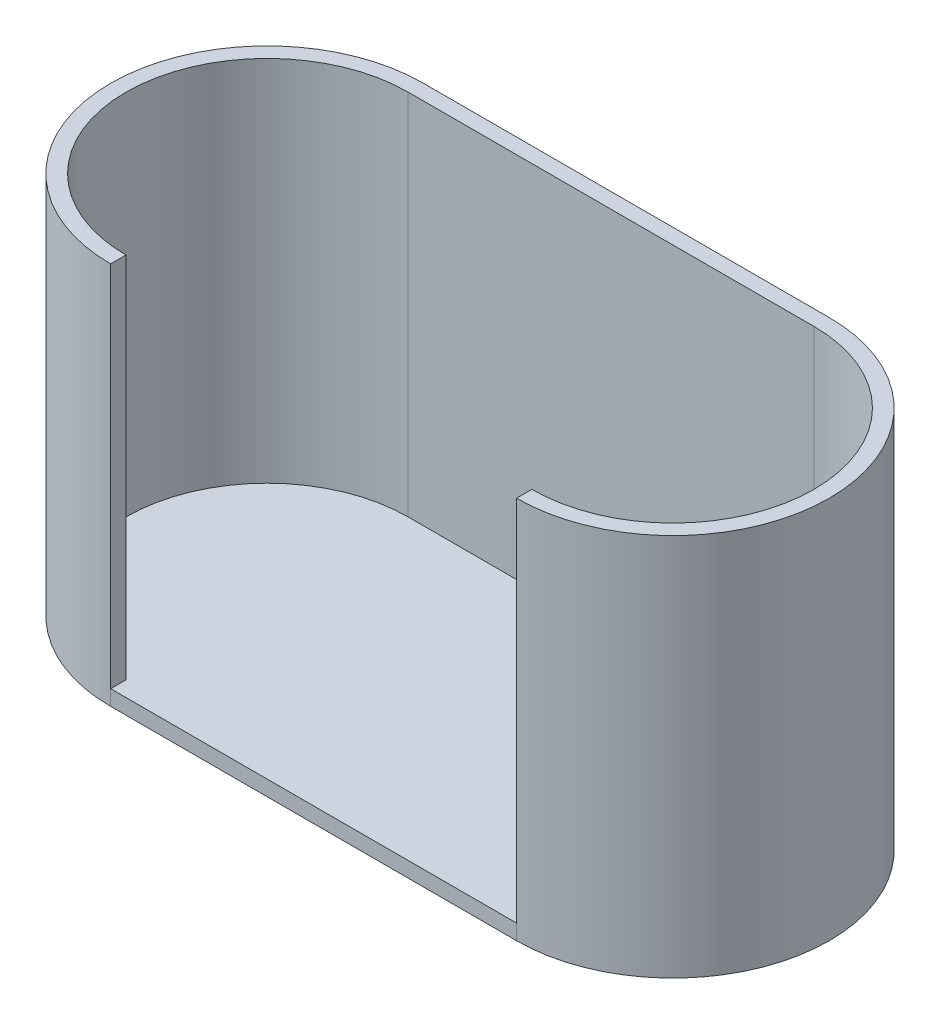
ISO-10303-21;
HEADER;
FILE_DESCRIPTION(('STEP AP214'),'2;1');
FILE_NAME('part.step','',(''),(''),'','','');
FILE_SCHEMA(('AUTOMOTIVE_DESIGN { 1 0 10303 214 1 1 1 1 }'));
ENDSEC;
DATA;
#1=APPLICATION_CONTEXT('core data for automotive mechanical design processes');
#2=APPLICATION_PROTOCOL_DEFINITION('international standard','automotive_design',2000,#1);
#3=PRODUCT_CONTEXT('',#1,'mechanical');
#4=PRODUCT('Part','Part','',(#3));
#5=PRODUCT_RELATED_PRODUCT_CATEGORY('part','',(#4));
#6=PRODUCT_DEFINITION_FORMATION('','',#4);
#7=PRODUCT_DEFINITION_CONTEXT('part definition',#1,'design');
#8=PRODUCT_DEFINITION('design','',#6,#7);
#9=PRODUCT_DEFINITION_SHAPE('','',#8);
#10=(LENGTH_UNIT() NAMED_UNIT(*) SI_UNIT(.MILLI.,.METRE.));
#11=(NAMED_UNIT(*) PLANE_ANGLE_UNIT() SI_UNIT($,.RADIAN.));
#12=(NAMED_UNIT(*) SI_UNIT($,.STERADIAN.) SOLID_ANGLE_UNIT());
#13=UNCERTAINTY_MEASURE_WITH_UNIT(LENGTH_MEASURE(1.E-05),#10,'distance_accuracy_value','');
#14=(GEOMETRIC_REPRESENTATION_CONTEXT(3) GLOBAL_UNCERTAINTY_ASSIGNED_CONTEXT((#13)) GLOBAL_UNIT_ASSIGNED_CONTEXT((#10,
#11,#12)) REPRESENTATION_CONTEXT('',''));
#15=CARTESIAN_POINT('',(0.,0.,0.));
#16=DIRECTION('',(0.,0.,1.));
#17=DIRECTION('',(1.,0.,0.));
#18=AXIS2_PLACEMENT_3D('',#15,#16,#17);
#19=CARTESIAN_POINT('',(-26.477298014183,50.,20.4070469493143));
#20=DIRECTION('',(0.,0.,-1.));
#21=DIRECTION('',(-1.,0.,0.));
#22=AXIS2_PLACEMENT_3D('',#19,#20,#21);
#23=PLANE('',#22);
#24=DIRECTION('',(1.,0.,0.));
#25=VECTOR('',#24,1.);
#26=CARTESIAN_POINT('',(-26.477298014183,2.,20.4070469493143));
#27=LINE('',#26,#25);
#28=CARTESIAN_POINT('',(-26.477298014183,2.,20.4070469493143));
#29=VERTEX_POINT('',#28);
#30=CARTESIAN_POINT('',(26.477298014183,2.,20.4070469493143));
#31=VERTEX_POINT('',#30);
#32=EDGE_CURVE('E139',#29,#31,#27,.T.);
#33=ORIENTED_EDGE('',*,*,#32,.F.);
#34=DIRECTION('',(0.,-1.,0.));
#35=VECTOR('',#34,1.);
#36=CARTESIAN_POINT('',(-26.477298014183,50.,20.4070469493143));
#37=LINE('',#36,#35);
#38=CARTESIAN_POINT('',(-26.477298014183,0.,20.4070469493143));
#39=VERTEX_POINT('',#38);
#40=EDGE_CURVE('E48',#29,#39,#37,.T.);
#41=ORIENTED_EDGE('',*,*,#40,.T.);
#42=DIRECTION('',(1.,0.,0.));
#43=VECTOR('',#42,1.);
#44=CARTESIAN_POINT('',(-26.477298014183,0.,20.4070469493143));
#45=LINE('',#44,#43);
#46=CARTESIAN_POINT('',(26.477298014183,0.,20.4070469493143));
#47=VERTEX_POINT('',#46);
#48=EDGE_CURVE('E107',#39,#47,#45,.T.);
#49=ORIENTED_EDGE('',*,*,#48,.T.);
#50=DIRECTION('',(0.,-1.,0.));
#51=VECTOR('',#50,1.);
#52=CARTESIAN_POINT('',(26.477298014183,50.,20.4070469493143));
#53=LINE('',#52,#51);
#54=EDGE_CURVE('E123',#31,#47,#53,.T.);
#55=ORIENTED_EDGE('',*,*,#54,.F.);
#56=EDGE_LOOP('',(#33,#41,#49,#55));
#57=FACE_BOUND('',#56,.T.);
#58=ADVANCED_FACE('F39',(#57),#23,.F.);
#59=CARTESIAN_POINT('',(-26.477298014183,50.,0.));
#60=DIRECTION('',(0.,-1.,0.));
#61=DIRECTION('',(0.,0.,-1.));
#62=AXIS2_PLACEMENT_3D('',#59,#60,#61);
#63=CYLINDRICAL_SURFACE('',#62,20.4070469493143);
#64=CARTESIAN_POINT('',(-26.477298014183,0.,0.));
#65=DIRECTION('',(0.,1.,0.));
#66=DIRECTION('',(0.,0.,1.));
#67=AXIS2_PLACEMENT_3D('',#64,#65,#66);
#68=CIRCLE('',#67,20.4070469493143);
#69=CARTESIAN_POINT('',(-26.477298014183,0.,-20.4070469493143));
#70=VERTEX_POINT('',#69);
#71=EDGE_CURVE('E100',#70,#39,#68,.T.);
#72=ORIENTED_EDGE('',*,*,#71,.T.);
#73=ORIENTED_EDGE('',*,*,#40,.F.);
#74=CARTESIAN_POINT('',(-26.477298014183,50.,20.4070469493143));
#75=VERTEX_POINT('',#74);
#76=EDGE_CURVE('E11',#75,#29,#37,.T.);
#77=ORIENTED_EDGE('',*,*,#76,.F.);
#78=CARTESIAN_POINT('',(-26.477298014183,50.,0.));
#79=DIRECTION('',(0.,1.,0.));
#80=DIRECTION('',(0.,0.,1.));
#81=AXIS2_PLACEMENT_3D('',#78,#79,#80);
#82=CIRCLE('',#81,20.4070469493143);
#83=CARTESIAN_POINT('',(-26.477298014183,50.,-20.4070469493143));
#84=VERTEX_POINT('',#83);
#85=EDGE_CURVE('E94',#84,#75,#82,.T.);
#86=ORIENTED_EDGE('',*,*,#85,.F.);
#87=DIRECTION('',(0.,-1.,0.));
#88=VECTOR('',#87,1.);
#89=CARTESIAN_POINT('',(-26.477298014183,50.,-20.4070469493143));
#90=LINE('',#89,#88);
#91=EDGE_CURVE('E86',#84,#70,#90,.T.);
#92=ORIENTED_EDGE('',*,*,#91,.T.);
#93=EDGE_LOOP('',(#72,#73,#77,#86,#92));
#94=FACE_BOUND('',#93,.T.);
#95=ADVANCED_FACE('F41',(#94),#63,.T.);
#96=CARTESIAN_POINT('',(26.477298014183,50.,0.));
#97=DIRECTION('',(0.,-1.,0.));
#98=DIRECTION('',(0.,0.,-1.));
#99=AXIS2_PLACEMENT_3D('',#96,#97,#98);
#100=CYLINDRICAL_SURFACE('',#99,20.4070469493143);
#101=CARTESIAN_POINT('',(26.477298014183,0.,0.));
#102=DIRECTION('',(0.,1.,0.));
#103=DIRECTION('',(0.,0.,1.));
#104=AXIS2_PLACEMENT_3D('',#101,#102,#103);
#105=CIRCLE('',#104,20.4070469493143);
#106=CARTESIAN_POINT('',(26.477298014183,0.,-20.4070469493143));
#107=VERTEX_POINT('',#106);
#108=EDGE_CURVE('E95',#47,#107,#105,.T.);
#109=ORIENTED_EDGE('',*,*,#108,.T.);
#110=DIRECTION('',(0.,-1.,0.));
#111=VECTOR('',#110,1.);
#112=CARTESIAN_POINT('',(26.477298014183,50.,-20.4070469493143));
#113=LINE('',#112,#111);
#114=CARTESIAN_POINT('',(26.477298014183,50.,-20.4070469493143));
#115=VERTEX_POINT('',#114);
#116=EDGE_CURVE('E89',#115,#107,#113,.T.);
#117=ORIENTED_EDGE('',*,*,#116,.F.);
#118=CARTESIAN_POINT('',(26.477298014183,50.,0.));
#119=DIRECTION('',(0.,1.,0.));
#120=DIRECTION('',(0.,0.,1.));
#121=AXIS2_PLACEMENT_3D('',#118,#119,#120);
#122=CIRCLE('',#121,20.4070469493143);
#123=CARTESIAN_POINT('',(26.477298014183,50.,20.4070469493143));
#124=VERTEX_POINT('',#123);
#125=EDGE_CURVE('E187',#124,#115,#122,.T.);
#126=ORIENTED_EDGE('',*,*,#125,.F.);
#127=EDGE_CURVE('E124',#124,#31,#53,.T.);
#128=ORIENTED_EDGE('',*,*,#127,.T.);
#129=ORIENTED_EDGE('',*,*,#54,.T.);
#130=EDGE_LOOP('',(#109,#117,#126,#128,#129));
#131=FACE_BOUND('',#130,.T.);
#132=ADVANCED_FACE('F134',(#131),#100,.T.);
#133=CARTESIAN_POINT('',(-26.477298014183,50.,-20.4070469493143));
#134=DIRECTION('',(0.,0.,1.));
#135=DIRECTION('',(1.,0.,0.));
#136=AXIS2_PLACEMENT_3D('',#133,#134,#135);
#137=PLANE('',#136);
#138=DIRECTION('',(-1.,0.,0.));
#139=VECTOR('',#138,1.);
#140=CARTESIAN_POINT('',(-26.477298014183,0.,-20.4070469493143));
#141=LINE('',#140,#139);
#142=EDGE_CURVE('E83',#107,#70,#141,.T.);
#143=ORIENTED_EDGE('',*,*,#142,.T.);
#144=ORIENTED_EDGE('',*,*,#91,.F.);
#145=DIRECTION('',(-1.,0.,0.));
#146=VECTOR('',#145,1.);
#147=CARTESIAN_POINT('',(-26.477298014183,50.,-20.4070469493143));
#148=LINE('',#147,#146);
#149=EDGE_CURVE('E64',#115,#84,#148,.T.);
#150=ORIENTED_EDGE('',*,*,#149,.F.);
#151=ORIENTED_EDGE('',*,*,#116,.T.);
#152=EDGE_LOOP('',(#143,#144,#150,#151));
#153=FACE_BOUND('',#152,.T.);
#154=ADVANCED_FACE('F85',(#153),#137,.F.);
#155=CARTESIAN_POINT('',(-26.477298014183,50.,0.));
#156=DIRECTION('',(0.,1.,0.));
#157=DIRECTION('',(0.,0.,1.));
#158=AXIS2_PLACEMENT_3D('',#155,#156,#157);
#159=PLANE('',#158);
#160=DIRECTION('',(0.,0.,1.));
#161=VECTOR('',#160,1.);
#162=CARTESIAN_POINT('',(-26.477298014183,50.,20.4070469493143));
#163=LINE('',#162,#161);
#164=CARTESIAN_POINT('',(-26.477298014183,50.,18.4070469493143));
#165=VERTEX_POINT('',#164);
#166=EDGE_CURVE('E109',#165,#75,#163,.T.);
#167=ORIENTED_EDGE('',*,*,#166,.F.);
#168=CARTESIAN_POINT('',(-26.477298014183,50.,0.));
#169=DIRECTION('',(0.,1.,0.));
#170=DIRECTION('',(0.,0.,1.));
#171=AXIS2_PLACEMENT_3D('',#168,#169,#170);
#172=CIRCLE('',#171,18.4070469493143);
#173=CARTESIAN_POINT('',(-26.477298014183,50.,-18.4070469493143));
#174=VERTEX_POINT('',#173);
#175=EDGE_CURVE('E166',#174,#165,#172,.T.);
#176=ORIENTED_EDGE('',*,*,#175,.F.);
#177=DIRECTION('',(-1.,0.,0.));
#178=VECTOR('',#177,1.);
#179=CARTESIAN_POINT('',(-26.477298014183,50.,-18.4070469493143));
#180=LINE('',#179,#178);
#181=CARTESIAN_POINT('',(26.477298014183,50.,-18.4070469493143));
#182=VERTEX_POINT('',#181);
#183=EDGE_CURVE('E202',#182,#174,#180,.T.);
#184=ORIENTED_EDGE('',*,*,#183,.F.);
#185=CARTESIAN_POINT('',(26.477298014183,50.,0.));
#186=DIRECTION('',(0.,1.,0.));
#187=DIRECTION('',(0.,0.,1.));
#188=AXIS2_PLACEMENT_3D('',#185,#186,#187);
#189=CIRCLE('',#188,18.4070469493143);
#190=CARTESIAN_POINT('',(26.477298014183,50.,18.4070469493143));
#191=VERTEX_POINT('',#190);
#192=EDGE_CURVE('E189',#191,#182,#189,.T.);
#193=ORIENTED_EDGE('',*,*,#192,.F.);
#194=DIRECTION('',(0.,0.,1.));
#195=VECTOR('',#194,1.);
#196=CARTESIAN_POINT('',(26.477298014183,50.,20.4070469493143));
#197=LINE('',#196,#195);
#198=EDGE_CURVE('E181',#191,#124,#197,.T.);
#199=ORIENTED_EDGE('',*,*,#198,.T.);
#200=ORIENTED_EDGE('',*,*,#125,.T.);
#201=ORIENTED_EDGE('',*,*,#149,.T.);
#202=ORIENTED_EDGE('',*,*,#85,.T.);
#203=EDGE_LOOP('',(#167,#176,#184,#193,#199,#200,#201,#202));
#204=FACE_BOUND('',#203,.T.);
#205=ADVANCED_FACE('F186',(#204),#159,.T.);
#206=CARTESIAN_POINT('',(-26.477298014183,0.,0.));
#207=DIRECTION('',(0.,1.,0.));
#208=DIRECTION('',(0.,0.,1.));
#209=AXIS2_PLACEMENT_3D('',#206,#207,#208);
#210=PLANE('',#209);
#211=ORIENTED_EDGE('',*,*,#71,.F.);
#212=ORIENTED_EDGE('',*,*,#142,.F.);
#213=ORIENTED_EDGE('',*,*,#108,.F.);
#214=ORIENTED_EDGE('',*,*,#48,.F.);
#215=EDGE_LOOP('',(#211,#212,#213,#214));
#216=FACE_BOUND('',#215,.T.);
#217=ADVANCED_FACE('F105',(#216),#210,.F.);
#218=CARTESIAN_POINT('',(-26.477298014183,50.,20.4070469493143));
#219=DIRECTION('',(1.,0.,0.));
#220=DIRECTION('',(0.,-1.,0.));
#221=AXIS2_PLACEMENT_3D('',#218,#219,#220);
#222=PLANE('',#221);
#223=ORIENTED_EDGE('',*,*,#76,.T.);
#224=DIRECTION('',(0.,0.,1.));
#225=VECTOR('',#224,1.);
#226=CARTESIAN_POINT('',(-26.477298014183,2.,20.4070469493143));
#227=LINE('',#226,#225);
#228=CARTESIAN_POINT('',(-26.477298014183,2.,18.4070469493143));
#229=VERTEX_POINT('',#228);
#230=EDGE_CURVE('E115',#229,#29,#227,.T.);
#231=ORIENTED_EDGE('',*,*,#230,.F.);
#232=DIRECTION('',(0.,-1.,0.));
#233=VECTOR('',#232,1.);
#234=CARTESIAN_POINT('',(-26.477298014183,50.,18.4070469493143));
#235=LINE('',#234,#233);
#236=EDGE_CURVE('E191',#165,#229,#235,.T.);
#237=ORIENTED_EDGE('',*,*,#236,.F.);
#238=ORIENTED_EDGE('',*,*,#166,.T.);
#239=EDGE_LOOP('',(#223,#231,#237,#238));
#240=FACE_BOUND('',#239,.T.);
#241=ADVANCED_FACE('F231',(#240),#222,.T.);
#242=CARTESIAN_POINT('',(26.477298014183,50.,20.4070469493143));
#243=DIRECTION('',(1.,0.,0.));
#244=DIRECTION('',(0.,-1.,0.));
#245=AXIS2_PLACEMENT_3D('',#242,#243,#244);
#246=PLANE('',#245);
#247=ORIENTED_EDGE('',*,*,#127,.F.);
#248=ORIENTED_EDGE('',*,*,#198,.F.);
#249=DIRECTION('',(0.,-1.,0.));
#250=VECTOR('',#249,1.);
#251=CARTESIAN_POINT('',(26.477298014183,50.,18.4070469493143));
#252=LINE('',#251,#250);
#253=CARTESIAN_POINT('',(26.477298014183,2.,18.4070469493143));
#254=VERTEX_POINT('',#253);
#255=EDGE_CURVE('E208',#191,#254,#252,.T.);
#256=ORIENTED_EDGE('',*,*,#255,.T.);
#257=DIRECTION('',(0.,0.,1.));
#258=VECTOR('',#257,1.);
#259=CARTESIAN_POINT('',(26.477298014183,2.,20.4070469493143));
#260=LINE('',#259,#258);
#261=EDGE_CURVE('E183',#254,#31,#260,.T.);
#262=ORIENTED_EDGE('',*,*,#261,.T.);
#263=EDGE_LOOP('',(#247,#248,#256,#262));
#264=FACE_BOUND('',#263,.T.);
#265=ADVANCED_FACE('F179',(#264),#246,.F.);
#266=CARTESIAN_POINT('',(-26.477298014183,50.,0.));
#267=DIRECTION('',(0.,-1.,0.));
#268=DIRECTION('',(0.,0.,-1.));
#269=AXIS2_PLACEMENT_3D('',#266,#267,#268);
#270=CYLINDRICAL_SURFACE('',#269,18.4070469493143);
#271=CARTESIAN_POINT('',(-26.477298014183,2.,0.));
#272=DIRECTION('',(0.,1.,0.));
#273=DIRECTION('',(0.,0.,1.));
#274=AXIS2_PLACEMENT_3D('',#271,#272,#273);
#275=CIRCLE('',#274,18.4070469493143);
#276=CARTESIAN_POINT('',(-26.477298014183,2.,-18.4070469493143));
#277=VERTEX_POINT('',#276);
#278=EDGE_CURVE('E216',#277,#229,#275,.T.);
#279=ORIENTED_EDGE('',*,*,#278,.F.);
#280=DIRECTION('',(0.,-1.,0.));
#281=VECTOR('',#280,1.);
#282=CARTESIAN_POINT('',(-26.477298014183,50.,-18.4070469493143));
#283=LINE('',#282,#281);
#284=EDGE_CURVE('E205',#174,#277,#283,.T.);
#285=ORIENTED_EDGE('',*,*,#284,.F.);
#286=ORIENTED_EDGE('',*,*,#175,.T.);
#287=ORIENTED_EDGE('',*,*,#236,.T.);
#288=EDGE_LOOP('',(#279,#285,#286,#287));
#289=FACE_BOUND('',#288,.T.);
#290=ADVANCED_FACE('F230',(#289),#270,.F.);
#291=CARTESIAN_POINT('',(26.477298014183,50.,0.));
#292=DIRECTION('',(0.,-1.,0.));
#293=DIRECTION('',(0.,0.,-1.));
#294=AXIS2_PLACEMENT_3D('',#291,#292,#293);
#295=CYLINDRICAL_SURFACE('',#294,18.4070469493143);
#296=CARTESIAN_POINT('',(26.477298014183,2.,0.));
#297=DIRECTION('',(0.,1.,0.));
#298=DIRECTION('',(0.,0.,1.));
#299=AXIS2_PLACEMENT_3D('',#296,#297,#298);
#300=CIRCLE('',#299,18.4070469493143);
#301=CARTESIAN_POINT('',(26.477298014183,2.,-18.4070469493143));
#302=VERTEX_POINT('',#301);
#303=EDGE_CURVE('E215',#254,#302,#300,.T.);
#304=ORIENTED_EDGE('',*,*,#303,.F.);
#305=ORIENTED_EDGE('',*,*,#255,.F.);
#306=ORIENTED_EDGE('',*,*,#192,.T.);
#307=DIRECTION('',(0.,1.,0.));
#308=VECTOR('',#307,1.);
#309=CARTESIAN_POINT('',(26.477298014183,50.,-18.4070469493143));
#310=LINE('',#309,#308);
#311=EDGE_CURVE('E55',#182,#302,#310,.F.);
#312=ORIENTED_EDGE('',*,*,#311,.T.);
#313=EDGE_LOOP('',(#304,#305,#306,#312));
#314=FACE_BOUND('',#313,.T.);
#315=ADVANCED_FACE('F234',(#314),#295,.F.);
#316=CARTESIAN_POINT('',(-26.477298014183,50.,-18.4070469493143));
#317=DIRECTION('',(0.,0.,1.));
#318=DIRECTION('',(1.,0.,0.));
#319=AXIS2_PLACEMENT_3D('',#316,#317,#318);
#320=PLANE('',#319);
#321=DIRECTION('',(-1.,0.,0.));
#322=VECTOR('',#321,1.);
#323=CARTESIAN_POINT('',(-26.477298014183,2.,-18.4070469493143));
#324=LINE('',#323,#322);
#325=EDGE_CURVE('E173',#302,#277,#324,.T.);
#326=ORIENTED_EDGE('',*,*,#325,.F.);
#327=ORIENTED_EDGE('',*,*,#311,.F.);
#328=ORIENTED_EDGE('',*,*,#183,.T.);
#329=ORIENTED_EDGE('',*,*,#284,.T.);
#330=EDGE_LOOP('',(#326,#327,#328,#329));
#331=FACE_BOUND('',#330,.T.);
#332=ADVANCED_FACE('F232',(#331),#320,.T.);
#333=CARTESIAN_POINT('',(-26.477298014183,2.,0.));
#334=DIRECTION('',(0.,1.,0.));
#335=DIRECTION('',(0.,0.,1.));
#336=AXIS2_PLACEMENT_3D('',#333,#334,#335);
#337=PLANE('',#336);
#338=ORIENTED_EDGE('',*,*,#278,.T.);
#339=ORIENTED_EDGE('',*,*,#230,.T.);
#340=ORIENTED_EDGE('',*,*,#32,.T.);
#341=ORIENTED_EDGE('',*,*,#261,.F.);
#342=ORIENTED_EDGE('',*,*,#303,.T.);
#343=ORIENTED_EDGE('',*,*,#325,.T.);
#344=EDGE_LOOP('',(#338,#339,#340,#341,#342,#343));
#345=FACE_BOUND('',#344,.T.);
#346=ADVANCED_FACE('F229',(#345),#337,.T.);
#347=CLOSED_SHELL('',(#58,#95,#132,#154,#205,#217,#241,#265,#290,#315,#332,#346));
#348=MANIFOLD_SOLID_BREP('B2',#347);
#349=ADVANCED_BREP_SHAPE_REPRESENTATION('',(#18,#348),#14);
#350=SHAPE_DEFINITION_REPRESENTATION(#9,#349);
ENDSEC;
END-ISO-10303-21;
